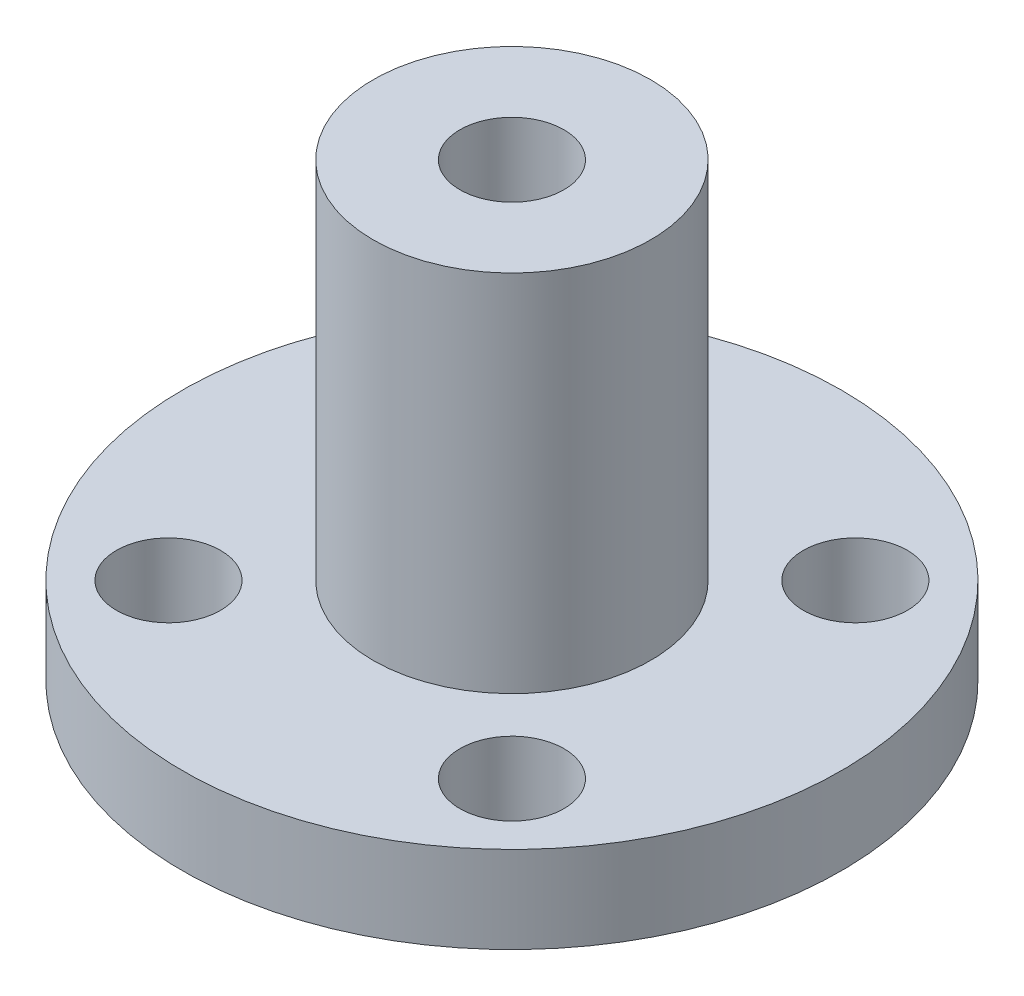
ISO-10303-21;
HEADER;
FILE_DESCRIPTION(('STEP AP214'),'2;1');
FILE_NAME('part.step','',(''),(''),'','','');
FILE_SCHEMA(('AUTOMOTIVE_DESIGN { 1 0 10303 214 1 1 1 1 }'));
ENDSEC;
DATA;
#1=APPLICATION_CONTEXT('core data for automotive mechanical design processes');
#2=APPLICATION_PROTOCOL_DEFINITION('international standard','automotive_design',2000,#1);
#3=PRODUCT_CONTEXT('',#1,'mechanical');
#4=PRODUCT('Part','Part','',(#3));
#5=PRODUCT_RELATED_PRODUCT_CATEGORY('part','',(#4));
#6=PRODUCT_DEFINITION_FORMATION('','',#4);
#7=PRODUCT_DEFINITION_CONTEXT('part definition',#1,'design');
#8=PRODUCT_DEFINITION('design','',#6,#7);
#9=PRODUCT_DEFINITION_SHAPE('','',#8);
#10=(LENGTH_UNIT() NAMED_UNIT(*) SI_UNIT(.MILLI.,.METRE.));
#11=(NAMED_UNIT(*) PLANE_ANGLE_UNIT() SI_UNIT($,.RADIAN.));
#12=(NAMED_UNIT(*) SI_UNIT($,.STERADIAN.) SOLID_ANGLE_UNIT());
#13=UNCERTAINTY_MEASURE_WITH_UNIT(LENGTH_MEASURE(1.E-05),#10,'distance_accuracy_value','');
#14=(GEOMETRIC_REPRESENTATION_CONTEXT(3) GLOBAL_UNCERTAINTY_ASSIGNED_CONTEXT((#13)) GLOBAL_UNIT_ASSIGNED_CONTEXT((#10,
#11,#12)) REPRESENTATION_CONTEXT('',''));
#15=CARTESIAN_POINT('',(0.,0.,0.));
#16=DIRECTION('',(0.,0.,1.));
#17=DIRECTION('',(1.,0.,0.));
#18=AXIS2_PLACEMENT_3D('',#15,#16,#17);
#19=CARTESIAN_POINT('',(0.,-0.965665236051485,0.));
#20=DIRECTION('',(0.,-1.,0.));
#21=DIRECTION('',(0.,0.,-1.));
#22=AXIS2_PLACEMENT_3D('',#19,#20,#21);
#23=CYLINDRICAL_SURFACE('',#22,9.5);
#24=CARTESIAN_POINT('',(0.,-1.22413604216874,0.));
#25=DIRECTION('',(0.,-1.,0.));
#26=DIRECTION('',(0.,0.,-1.));
#27=AXIS2_PLACEMENT_3D('',#24,#25,#26);
#28=CIRCLE('',#27,9.5);
#29=CARTESIAN_POINT('',(0.,-1.22413604216874,-9.5));
#30=VERTEX_POINT('',#29);
#31=EDGE_CURVE('E53',#30,#30,#28,.T.);
#32=ORIENTED_EDGE('',*,*,#31,.F.);
#33=EDGE_LOOP('',(#32));
#34=FACE_BOUND('',#33,.T.);
#35=CARTESIAN_POINT('',(0.,1.27586395783126,0.));
#36=DIRECTION('',(0.,-1.,0.));
#37=DIRECTION('',(0.,0.,-1.));
#38=AXIS2_PLACEMENT_3D('',#35,#36,#37);
#39=CIRCLE('',#38,9.5);
#40=CARTESIAN_POINT('',(0.,1.27586395783126,-9.5));
#41=VERTEX_POINT('',#40);
#42=EDGE_CURVE('E10',#41,#41,#39,.T.);
#43=ORIENTED_EDGE('',*,*,#42,.T.);
#44=EDGE_LOOP('',(#43));
#45=FACE_BOUND('',#44,.T.);
#46=ADVANCED_FACE('F31',(#34,#45),#23,.T.);
#47=CARTESIAN_POINT('',(-9.5,1.27586395783126,0.));
#48=DIRECTION('',(0.,-1.,0.));
#49=DIRECTION('',(0.,0.,-1.));
#50=AXIS2_PLACEMENT_3D('',#47,#48,#49);
#51=PLANE('',#50);
#52=CARTESIAN_POINT('',(-4.9497474683038,1.27586395783126,-4.94974746830587));
#53=DIRECTION('',(0.,-1.,0.));
#54=DIRECTION('',(0.,0.,-1.));
#55=AXIS2_PLACEMENT_3D('',#52,#53,#54);
#56=CIRCLE('',#55,1.5);
#57=CARTESIAN_POINT('',(-4.9497474683038,1.27586395783126,-6.44974746830587));
#58=VERTEX_POINT('',#57);
#59=EDGE_CURVE('E56',#58,#58,#56,.T.);
#60=ORIENTED_EDGE('',*,*,#59,.T.);
#61=EDGE_LOOP('',(#60));
#62=FACE_BOUND('',#61,.T.);
#63=CARTESIAN_POINT('',(4.94974746830787,1.27586395783126,-4.94974746830381));
#64=DIRECTION('',(0.,-1.,0.));
#65=DIRECTION('',(0.,0.,-1.));
#66=AXIS2_PLACEMENT_3D('',#63,#64,#65);
#67=CIRCLE('',#66,1.5);
#68=CARTESIAN_POINT('',(4.94974746830787,1.27586395783126,-6.4497474683038));
#69=VERTEX_POINT('',#68);
#70=EDGE_CURVE('E59',#69,#69,#67,.T.);
#71=ORIENTED_EDGE('',*,*,#70,.T.);
#72=EDGE_LOOP('',(#71));
#73=FACE_BOUND('',#72,.T.);
#74=CARTESIAN_POINT('',(4.94974746830581,1.27586395783126,4.94974746830786));
#75=DIRECTION('',(0.,-1.,0.));
#76=DIRECTION('',(0.,0.,-1.));
#77=AXIS2_PLACEMENT_3D('',#74,#75,#76);
#78=CIRCLE('',#77,1.5);
#79=CARTESIAN_POINT('',(4.94974746830581,1.27586395783126,3.44974746830787));
#80=VERTEX_POINT('',#79);
#81=EDGE_CURVE('E62',#80,#80,#78,.T.);
#82=ORIENTED_EDGE('',*,*,#81,.T.);
#83=EDGE_LOOP('',(#82));
#84=FACE_BOUND('',#83,.T.);
#85=CARTESIAN_POINT('',(-4.94974746830586,1.27586395783126,4.94974746830581));
#86=DIRECTION('',(0.,-1.,0.));
#87=DIRECTION('',(0.,0.,-1.));
#88=AXIS2_PLACEMENT_3D('',#85,#86,#87);
#89=CIRCLE('',#88,1.5);
#90=CARTESIAN_POINT('',(-4.94974746830586,1.27586395783126,3.4497474683058));
#91=VERTEX_POINT('',#90);
#92=EDGE_CURVE('E65',#91,#91,#89,.T.);
#93=ORIENTED_EDGE('',*,*,#92,.T.);
#94=EDGE_LOOP('',(#93));
#95=FACE_BOUND('',#94,.T.);
#96=ORIENTED_EDGE('',*,*,#42,.F.);
#97=EDGE_LOOP('',(#96));
#98=FACE_BOUND('',#97,.T.);
#99=CARTESIAN_POINT('',(0.,1.27586395783126,0.));
#100=DIRECTION('',(0.,-1.,0.));
#101=DIRECTION('',(0.,0.,-1.));
#102=AXIS2_PLACEMENT_3D('',#99,#100,#101);
#103=CIRCLE('',#102,4.);
#104=CARTESIAN_POINT('',(0.,1.27586395783126,-4.));
#105=VERTEX_POINT('',#104);
#106=EDGE_CURVE('E37',#105,#105,#103,.T.);
#107=ORIENTED_EDGE('',*,*,#106,.T.);
#108=EDGE_LOOP('',(#107));
#109=FACE_BOUND('',#108,.T.);
#110=ADVANCED_FACE('F98',(#62,#73,#84,#95,#98,#109),#51,.F.);
#111=CARTESIAN_POINT('',(0.,-0.965665236051485,0.));
#112=DIRECTION('',(0.,-1.,0.));
#113=DIRECTION('',(0.,0.,-1.));
#114=AXIS2_PLACEMENT_3D('',#111,#112,#113);
#115=CYLINDRICAL_SURFACE('',#114,4.);
#116=ORIENTED_EDGE('',*,*,#106,.F.);
#117=EDGE_LOOP('',(#116));
#118=FACE_BOUND('',#117,.T.);
#119=CARTESIAN_POINT('',(0.,11.7758639578313,0.));
#120=DIRECTION('',(0.,-1.,0.));
#121=DIRECTION('',(0.,0.,-1.));
#122=AXIS2_PLACEMENT_3D('',#119,#120,#121);
#123=CIRCLE('',#122,4.);
#124=CARTESIAN_POINT('',(0.,11.7758639578313,-4.));
#125=VERTEX_POINT('',#124);
#126=EDGE_CURVE('E41',#125,#125,#123,.T.);
#127=ORIENTED_EDGE('',*,*,#126,.T.);
#128=EDGE_LOOP('',(#127));
#129=FACE_BOUND('',#128,.T.);
#130=ADVANCED_FACE('F102',(#118,#129),#115,.T.);
#131=CARTESIAN_POINT('',(-4.,11.7758639578313,0.));
#132=DIRECTION('',(0.,-1.,0.));
#133=DIRECTION('',(0.,0.,-1.));
#134=AXIS2_PLACEMENT_3D('',#131,#132,#133);
#135=PLANE('',#134);
#136=ORIENTED_EDGE('',*,*,#126,.F.);
#137=EDGE_LOOP('',(#136));
#138=FACE_BOUND('',#137,.T.);
#139=CARTESIAN_POINT('',(0.,11.7758639578313,0.));
#140=DIRECTION('',(0.,-1.,0.));
#141=DIRECTION('',(0.,0.,-1.));
#142=AXIS2_PLACEMENT_3D('',#139,#140,#141);
#143=CIRCLE('',#142,1.5);
#144=CARTESIAN_POINT('',(0.,11.7758639578313,-1.5));
#145=VERTEX_POINT('',#144);
#146=EDGE_CURVE('E45',#145,#145,#143,.T.);
#147=ORIENTED_EDGE('',*,*,#146,.T.);
#148=EDGE_LOOP('',(#147));
#149=FACE_BOUND('',#148,.T.);
#150=ADVANCED_FACE('F107',(#138,#149),#135,.F.);
#151=CARTESIAN_POINT('',(0.,-0.965665236051485,0.));
#152=DIRECTION('',(0.,-1.,0.));
#153=DIRECTION('',(0.,0.,-1.));
#154=AXIS2_PLACEMENT_3D('',#151,#152,#153);
#155=CYLINDRICAL_SURFACE('',#154,1.5);
#156=ORIENTED_EDGE('',*,*,#146,.F.);
#157=EDGE_LOOP('',(#156));
#158=FACE_BOUND('',#157,.T.);
#159=CARTESIAN_POINT('',(0.,-1.22413604216874,0.));
#160=DIRECTION('',(0.,-1.,0.));
#161=DIRECTION('',(0.,0.,-1.));
#162=AXIS2_PLACEMENT_3D('',#159,#160,#161);
#163=CIRCLE('',#162,1.5);
#164=CARTESIAN_POINT('',(0.,-1.22413604216874,-1.5));
#165=VERTEX_POINT('',#164);
#166=EDGE_CURVE('E50',#165,#165,#163,.T.);
#167=ORIENTED_EDGE('',*,*,#166,.T.);
#168=EDGE_LOOP('',(#167));
#169=FACE_BOUND('',#168,.T.);
#170=ADVANCED_FACE('F88',(#158,#169),#155,.F.);
#171=CARTESIAN_POINT('',(-1.5,-1.22413604216874,0.));
#172=DIRECTION('',(0.,1.,0.));
#173=DIRECTION('',(0.,0.,1.));
#174=AXIS2_PLACEMENT_3D('',#171,#172,#173);
#175=PLANE('',#174);
#176=CARTESIAN_POINT('',(-4.9497474683038,-1.22413604216874,-4.94974746830587));
#177=DIRECTION('',(0.,-1.,0.));
#178=DIRECTION('',(0.,0.,-1.));
#179=AXIS2_PLACEMENT_3D('',#176,#177,#178);
#180=CIRCLE('',#179,1.5);
#181=CARTESIAN_POINT('',(-4.9497474683038,-1.22413604216874,-6.44974746830587));
#182=VERTEX_POINT('',#181);
#183=EDGE_CURVE('E72',#182,#182,#180,.T.);
#184=ORIENTED_EDGE('',*,*,#183,.F.);
#185=EDGE_LOOP('',(#184));
#186=FACE_BOUND('',#185,.T.);
#187=CARTESIAN_POINT('',(4.94974746830787,-1.22413604216874,-4.94974746830381));
#188=DIRECTION('',(0.,-1.,0.));
#189=DIRECTION('',(0.,0.,-1.));
#190=AXIS2_PLACEMENT_3D('',#187,#188,#189);
#191=CIRCLE('',#190,1.5);
#192=CARTESIAN_POINT('',(4.94974746830787,-1.22413604216874,-6.4497474683038));
#193=VERTEX_POINT('',#192);
#194=EDGE_CURVE('E75',#193,#193,#191,.T.);
#195=ORIENTED_EDGE('',*,*,#194,.F.);
#196=EDGE_LOOP('',(#195));
#197=FACE_BOUND('',#196,.T.);
#198=CARTESIAN_POINT('',(4.94974746830581,-1.22413604216874,4.94974746830786));
#199=DIRECTION('',(0.,-1.,0.));
#200=DIRECTION('',(0.,0.,-1.));
#201=AXIS2_PLACEMENT_3D('',#198,#199,#200);
#202=CIRCLE('',#201,1.5);
#203=CARTESIAN_POINT('',(4.94974746830581,-1.22413604216874,3.44974746830787));
#204=VERTEX_POINT('',#203);
#205=EDGE_CURVE('E71',#204,#204,#202,.T.);
#206=ORIENTED_EDGE('',*,*,#205,.F.);
#207=EDGE_LOOP('',(#206));
#208=FACE_BOUND('',#207,.T.);
#209=CARTESIAN_POINT('',(-4.94974746830586,-1.22413604216874,4.94974746830581));
#210=DIRECTION('',(0.,-1.,0.));
#211=DIRECTION('',(0.,0.,-1.));
#212=AXIS2_PLACEMENT_3D('',#209,#210,#211);
#213=CIRCLE('',#212,1.5);
#214=CARTESIAN_POINT('',(-4.94974746830586,-1.22413604216874,3.4497474683058));
#215=VERTEX_POINT('',#214);
#216=EDGE_CURVE('E68',#215,#215,#213,.T.);
#217=ORIENTED_EDGE('',*,*,#216,.F.);
#218=EDGE_LOOP('',(#217));
#219=FACE_BOUND('',#218,.T.);
#220=ORIENTED_EDGE('',*,*,#166,.F.);
#221=EDGE_LOOP('',(#220));
#222=FACE_BOUND('',#221,.T.);
#223=ORIENTED_EDGE('',*,*,#31,.T.);
#224=EDGE_LOOP('',(#223));
#225=FACE_BOUND('',#224,.T.);
#226=ADVANCED_FACE('F84',(#186,#197,#208,#219,#222,#225),#175,.F.);
#227=CARTESIAN_POINT('',(-4.94974746830586,29.7758639578313,4.94974746830581));
#228=DIRECTION('',(0.,-1.,0.));
#229=DIRECTION('',(0.,0.,-1.));
#230=AXIS2_PLACEMENT_3D('',#227,#228,#229);
#231=CYLINDRICAL_SURFACE('',#230,1.5);
#232=ORIENTED_EDGE('',*,*,#216,.T.);
#233=EDGE_LOOP('',(#232));
#234=FACE_BOUND('',#233,.T.);
#235=ORIENTED_EDGE('',*,*,#92,.F.);
#236=EDGE_LOOP('',(#235));
#237=FACE_BOUND('',#236,.T.);
#238=ADVANCED_FACE('F87',(#234,#237),#231,.F.);
#239=CARTESIAN_POINT('',(4.94974746830581,29.7758639578313,4.94974746830786));
#240=DIRECTION('',(0.,-1.,0.));
#241=DIRECTION('',(0.,0.,-1.));
#242=AXIS2_PLACEMENT_3D('',#239,#240,#241);
#243=CYLINDRICAL_SURFACE('',#242,1.5);
#244=ORIENTED_EDGE('',*,*,#205,.T.);
#245=EDGE_LOOP('',(#244));
#246=FACE_BOUND('',#245,.T.);
#247=ORIENTED_EDGE('',*,*,#81,.F.);
#248=EDGE_LOOP('',(#247));
#249=FACE_BOUND('',#248,.T.);
#250=ADVANCED_FACE('F81',(#246,#249),#243,.F.);
#251=CARTESIAN_POINT('',(4.94974746830787,29.7758639578313,-4.94974746830381));
#252=DIRECTION('',(0.,-1.,0.));
#253=DIRECTION('',(0.,0.,-1.));
#254=AXIS2_PLACEMENT_3D('',#251,#252,#253);
#255=CYLINDRICAL_SURFACE('',#254,1.5);
#256=ORIENTED_EDGE('',*,*,#194,.T.);
#257=EDGE_LOOP('',(#256));
#258=FACE_BOUND('',#257,.T.);
#259=ORIENTED_EDGE('',*,*,#70,.F.);
#260=EDGE_LOOP('',(#259));
#261=FACE_BOUND('',#260,.T.);
#262=ADVANCED_FACE('F124',(#258,#261),#255,.F.);
#263=CARTESIAN_POINT('',(-4.9497474683038,29.7758639578313,-4.94974746830587));
#264=DIRECTION('',(0.,-1.,0.));
#265=DIRECTION('',(0.,0.,-1.));
#266=AXIS2_PLACEMENT_3D('',#263,#264,#265);
#267=CYLINDRICAL_SURFACE('',#266,1.5);
#268=ORIENTED_EDGE('',*,*,#183,.T.);
#269=EDGE_LOOP('',(#268));
#270=FACE_BOUND('',#269,.T.);
#271=ORIENTED_EDGE('',*,*,#59,.F.);
#272=EDGE_LOOP('',(#271));
#273=FACE_BOUND('',#272,.T.);
#274=ADVANCED_FACE('F121',(#270,#273),#267,.F.);
#275=CLOSED_SHELL('',(#46,#110,#130,#150,#170,#226,#238,#250,#262,#274));
#276=MANIFOLD_SOLID_BREP('B2',#275);
#277=ADVANCED_BREP_SHAPE_REPRESENTATION('',(#18,#276),#14);
#278=SHAPE_DEFINITION_REPRESENTATION(#9,#277);
ENDSEC;
END-ISO-10303-21;
